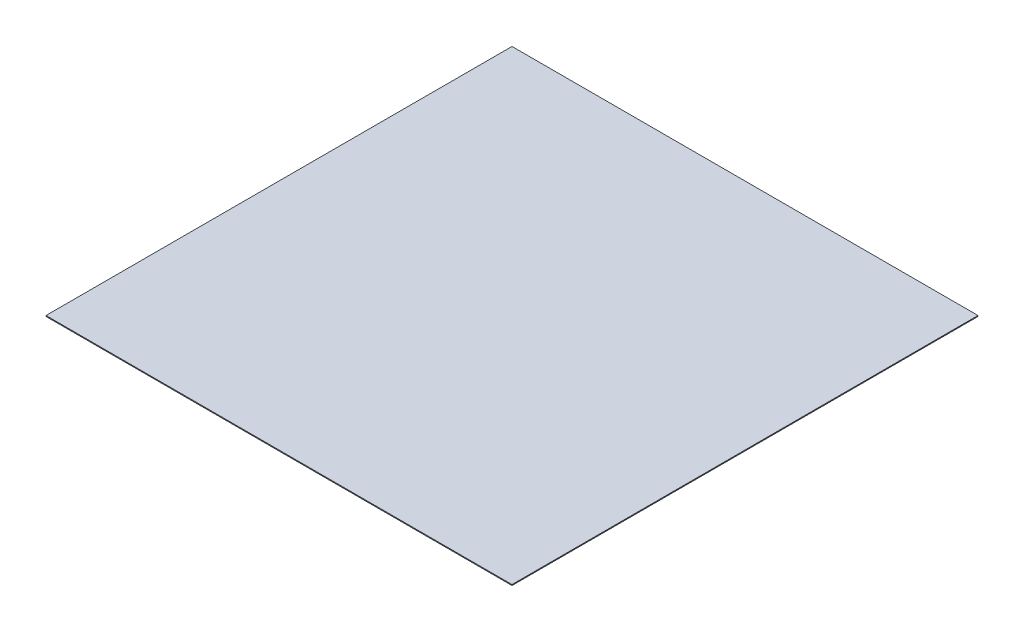
ISO-10303-21;
HEADER;
FILE_DESCRIPTION(('STEP AP214'),'2;1');
FILE_NAME('part.step','',(''),(''),'','','');
FILE_SCHEMA(('AUTOMOTIVE_DESIGN { 1 0 10303 214 1 1 1 1 }'));
ENDSEC;
DATA;
#1=APPLICATION_CONTEXT('core data for automotive mechanical design processes');
#2=APPLICATION_PROTOCOL_DEFINITION('international standard','automotive_design',2000,#1);
#3=PRODUCT_CONTEXT('',#1,'mechanical');
#4=PRODUCT('Part','Part','',(#3));
#5=PRODUCT_RELATED_PRODUCT_CATEGORY('part','',(#4));
#6=PRODUCT_DEFINITION_FORMATION('','',#4);
#7=PRODUCT_DEFINITION_CONTEXT('part definition',#1,'design');
#8=PRODUCT_DEFINITION('design','',#6,#7);
#9=PRODUCT_DEFINITION_SHAPE('','',#8);
#10=(LENGTH_UNIT() NAMED_UNIT(*) SI_UNIT(.MILLI.,.METRE.));
#11=(NAMED_UNIT(*) PLANE_ANGLE_UNIT() SI_UNIT($,.RADIAN.));
#12=(NAMED_UNIT(*) SI_UNIT($,.STERADIAN.) SOLID_ANGLE_UNIT());
#13=UNCERTAINTY_MEASURE_WITH_UNIT(LENGTH_MEASURE(1.E-05),#10,'distance_accuracy_value','');
#14=(GEOMETRIC_REPRESENTATION_CONTEXT(3) GLOBAL_UNCERTAINTY_ASSIGNED_CONTEXT((#13)) GLOBAL_UNIT_ASSIGNED_CONTEXT((#10,
#11,#12)) REPRESENTATION_CONTEXT('',''));
#15=CARTESIAN_POINT('',(0.,0.,0.));
#16=DIRECTION('',(0.,0.,1.));
#17=DIRECTION('',(1.,0.,0.));
#18=AXIS2_PLACEMENT_3D('',#15,#16,#17);
#19=CARTESIAN_POINT('',(-1675.,6.35,1675.));
#20=DIRECTION('',(1.,0.,0.));
#21=DIRECTION('',(0.,0.,-1.));
#22=AXIS2_PLACEMENT_3D('',#19,#20,#21);
#23=PLANE('',#22);
#24=DIRECTION('',(0.,0.,1.));
#25=VECTOR('',#24,1.);
#26=CARTESIAN_POINT('',(-1675.,0.,1675.));
#27=LINE('',#26,#25);
#28=CARTESIAN_POINT('',(-1675.,0.,-1675.));
#29=VERTEX_POINT('',#28);
#30=CARTESIAN_POINT('',(-1675.,0.,1675.));
#31=VERTEX_POINT('',#30);
#32=EDGE_CURVE('E96',#29,#31,#27,.T.);
#33=ORIENTED_EDGE('',*,*,#32,.T.);
#34=DIRECTION('',(0.,-1.,0.));
#35=VECTOR('',#34,1.);
#36=CARTESIAN_POINT('',(-1675.,6.35,1675.));
#37=LINE('',#36,#35);
#38=CARTESIAN_POINT('',(-1675.,6.35,1675.));
#39=VERTEX_POINT('',#38);
#40=EDGE_CURVE('E11',#39,#31,#37,.T.);
#41=ORIENTED_EDGE('',*,*,#40,.F.);
#42=DIRECTION('',(0.,0.,1.));
#43=VECTOR('',#42,1.);
#44=CARTESIAN_POINT('',(-1675.,6.35,1675.));
#45=LINE('',#44,#43);
#46=CARTESIAN_POINT('',(-1675.,6.35,-1675.));
#47=VERTEX_POINT('',#46);
#48=EDGE_CURVE('E84',#47,#39,#45,.T.);
#49=ORIENTED_EDGE('',*,*,#48,.F.);
#50=DIRECTION('',(0.,-1.,0.));
#51=VECTOR('',#50,1.);
#52=CARTESIAN_POINT('',(-1675.,6.35,-1675.));
#53=LINE('',#52,#51);
#54=EDGE_CURVE('E92',#47,#29,#53,.T.);
#55=ORIENTED_EDGE('',*,*,#54,.T.);
#56=EDGE_LOOP('',(#33,#41,#49,#55));
#57=FACE_BOUND('',#56,.T.);
#58=ADVANCED_FACE('F33',(#57),#23,.F.);
#59=CARTESIAN_POINT('',(1675.,6.35,1675.));
#60=DIRECTION('',(0.,0.,-1.));
#61=DIRECTION('',(-1.,0.,0.));
#62=AXIS2_PLACEMENT_3D('',#59,#60,#61);
#63=PLANE('',#62);
#64=DIRECTION('',(1.,0.,0.));
#65=VECTOR('',#64,1.);
#66=CARTESIAN_POINT('',(1675.,0.,1675.));
#67=LINE('',#66,#65);
#68=CARTESIAN_POINT('',(1675.,0.,1675.));
#69=VERTEX_POINT('',#68);
#70=EDGE_CURVE('E88',#31,#69,#67,.T.);
#71=ORIENTED_EDGE('',*,*,#70,.T.);
#72=DIRECTION('',(0.,-1.,0.));
#73=VECTOR('',#72,1.);
#74=CARTESIAN_POINT('',(1675.,6.35,1675.));
#75=LINE('',#74,#73);
#76=CARTESIAN_POINT('',(1675.,6.35,1675.));
#77=VERTEX_POINT('',#76);
#78=EDGE_CURVE('E41',#77,#69,#75,.T.);
#79=ORIENTED_EDGE('',*,*,#78,.F.);
#80=DIRECTION('',(1.,0.,0.));
#81=VECTOR('',#80,1.);
#82=CARTESIAN_POINT('',(1675.,6.35,1675.));
#83=LINE('',#82,#81);
#84=EDGE_CURVE('E79',#39,#77,#83,.T.);
#85=ORIENTED_EDGE('',*,*,#84,.F.);
#86=ORIENTED_EDGE('',*,*,#40,.T.);
#87=EDGE_LOOP('',(#71,#79,#85,#86));
#88=FACE_BOUND('',#87,.T.);
#89=ADVANCED_FACE('F87',(#88),#63,.F.);
#90=CARTESIAN_POINT('',(1675.,6.35,1675.));
#91=DIRECTION('',(-1.,0.,0.));
#92=DIRECTION('',(0.,0.,1.));
#93=AXIS2_PLACEMENT_3D('',#90,#91,#92);
#94=PLANE('',#93);
#95=DIRECTION('',(0.,0.,-1.));
#96=VECTOR('',#95,1.);
#97=CARTESIAN_POINT('',(1675.,0.,1675.));
#98=LINE('',#97,#96);
#99=CARTESIAN_POINT('',(1675.,0.,-1675.));
#100=VERTEX_POINT('',#99);
#101=EDGE_CURVE('E66',#69,#100,#98,.T.);
#102=ORIENTED_EDGE('',*,*,#101,.T.);
#103=DIRECTION('',(0.,-1.,0.));
#104=VECTOR('',#103,1.);
#105=CARTESIAN_POINT('',(1675.,6.35,-1675.));
#106=LINE('',#105,#104);
#107=CARTESIAN_POINT('',(1675.,6.35,-1675.));
#108=VERTEX_POINT('',#107);
#109=EDGE_CURVE('E89',#108,#100,#106,.T.);
#110=ORIENTED_EDGE('',*,*,#109,.F.);
#111=DIRECTION('',(0.,0.,-1.));
#112=VECTOR('',#111,1.);
#113=CARTESIAN_POINT('',(1675.,6.35,1675.));
#114=LINE('',#113,#112);
#115=EDGE_CURVE('E82',#77,#108,#114,.T.);
#116=ORIENTED_EDGE('',*,*,#115,.F.);
#117=ORIENTED_EDGE('',*,*,#78,.T.);
#118=EDGE_LOOP('',(#102,#110,#116,#117));
#119=FACE_BOUND('',#118,.T.);
#120=ADVANCED_FACE('F90',(#119),#94,.F.);
#121=CARTESIAN_POINT('',(1675.,6.35,-1675.));
#122=DIRECTION('',(0.,0.,1.));
#123=DIRECTION('',(1.,0.,0.));
#124=AXIS2_PLACEMENT_3D('',#121,#122,#123);
#125=PLANE('',#124);
#126=DIRECTION('',(-1.,0.,0.));
#127=VECTOR('',#126,1.);
#128=CARTESIAN_POINT('',(1675.,0.,-1675.));
#129=LINE('',#128,#127);
#130=EDGE_CURVE('E72',#100,#29,#129,.T.);
#131=ORIENTED_EDGE('',*,*,#130,.T.);
#132=ORIENTED_EDGE('',*,*,#54,.F.);
#133=DIRECTION('',(-1.,0.,0.));
#134=VECTOR('',#133,1.);
#135=CARTESIAN_POINT('',(1675.,6.35,-1675.));
#136=LINE('',#135,#134);
#137=EDGE_CURVE('E49',#108,#47,#136,.T.);
#138=ORIENTED_EDGE('',*,*,#137,.F.);
#139=ORIENTED_EDGE('',*,*,#109,.T.);
#140=EDGE_LOOP('',(#131,#132,#138,#139));
#141=FACE_BOUND('',#140,.T.);
#142=ADVANCED_FACE('F103',(#141),#125,.F.);
#143=CARTESIAN_POINT('',(0.,6.35,0.));
#144=DIRECTION('',(0.,1.,0.));
#145=DIRECTION('',(0.,0.,1.));
#146=AXIS2_PLACEMENT_3D('',#143,#144,#145);
#147=PLANE('',#146);
#148=ORIENTED_EDGE('',*,*,#48,.T.);
#149=ORIENTED_EDGE('',*,*,#84,.T.);
#150=ORIENTED_EDGE('',*,*,#115,.T.);
#151=ORIENTED_EDGE('',*,*,#137,.T.);
#152=EDGE_LOOP('',(#148,#149,#150,#151));
#153=FACE_BOUND('',#152,.T.);
#154=ADVANCED_FACE('F80',(#153),#147,.T.);
#155=CARTESIAN_POINT('',(0.,0.,0.));
#156=DIRECTION('',(0.,1.,0.));
#157=DIRECTION('',(0.,0.,1.));
#158=AXIS2_PLACEMENT_3D('',#155,#156,#157);
#159=PLANE('',#158);
#160=ORIENTED_EDGE('',*,*,#32,.F.);
#161=ORIENTED_EDGE('',*,*,#130,.F.);
#162=ORIENTED_EDGE('',*,*,#101,.F.);
#163=ORIENTED_EDGE('',*,*,#70,.F.);
#164=EDGE_LOOP('',(#160,#161,#162,#163));
#165=FACE_BOUND('',#164,.T.);
#166=ADVANCED_FACE('F106',(#165),#159,.F.);
#167=CLOSED_SHELL('',(#58,#89,#120,#142,#154,#166));
#168=MANIFOLD_SOLID_BREP('B2',#167);
#169=ADVANCED_BREP_SHAPE_REPRESENTATION('',(#18,#168),#14);
#170=SHAPE_DEFINITION_REPRESENTATION(#9,#169);
ENDSEC;
END-ISO-10303-21;
